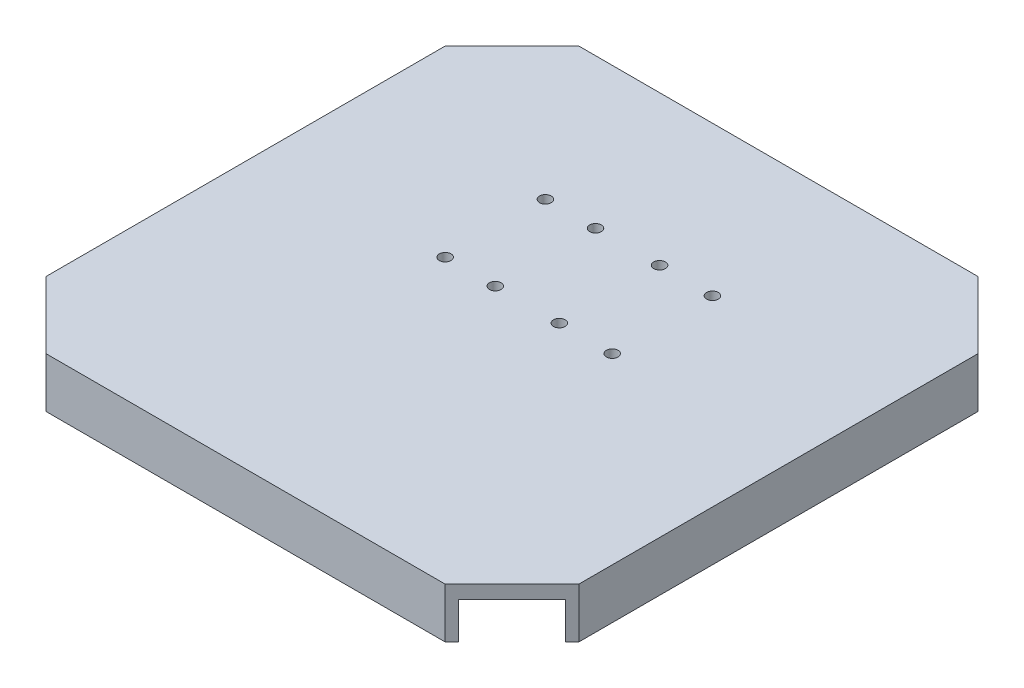
ISO-10303-21;
HEADER;
FILE_DESCRIPTION(('STEP AP214'),'2;1');
FILE_NAME('part.step','',(''),(''),'','','');
FILE_SCHEMA(('AUTOMOTIVE_DESIGN { 1 0 10303 214 1 1 1 1 }'));
ENDSEC;
DATA;
#1=APPLICATION_CONTEXT('core data for automotive mechanical design processes');
#2=APPLICATION_PROTOCOL_DEFINITION('international standard','automotive_design',2000,#1);
#3=PRODUCT_CONTEXT('',#1,'mechanical');
#4=PRODUCT('Part','Part','',(#3));
#5=PRODUCT_RELATED_PRODUCT_CATEGORY('part','',(#4));
#6=PRODUCT_DEFINITION_FORMATION('','',#4);
#7=PRODUCT_DEFINITION_CONTEXT('part definition',#1,'design');
#8=PRODUCT_DEFINITION('design','',#6,#7);
#9=PRODUCT_DEFINITION_SHAPE('','',#8);
#10=(LENGTH_UNIT() NAMED_UNIT(*) SI_UNIT(.MILLI.,.METRE.));
#11=(NAMED_UNIT(*) PLANE_ANGLE_UNIT() SI_UNIT($,.RADIAN.));
#12=(NAMED_UNIT(*) SI_UNIT($,.STERADIAN.) SOLID_ANGLE_UNIT());
#13=UNCERTAINTY_MEASURE_WITH_UNIT(LENGTH_MEASURE(1.E-05),#10,'distance_accuracy_value','');
#14=(GEOMETRIC_REPRESENTATION_CONTEXT(3) GLOBAL_UNCERTAINTY_ASSIGNED_CONTEXT((#13)) GLOBAL_UNIT_ASSIGNED_CONTEXT((#10,
#11,#12)) REPRESENTATION_CONTEXT('',''));
#15=CARTESIAN_POINT('',(0.,0.,0.));
#16=DIRECTION('',(0.,0.,1.));
#17=DIRECTION('',(1.,0.,0.));
#18=AXIS2_PLACEMENT_3D('',#15,#16,#17);
#19=CARTESIAN_POINT('',(0.,15.,0.));
#20=DIRECTION('',(0.,1.,0.));
#21=DIRECTION('',(0.,0.,1.));
#22=AXIS2_PLACEMENT_3D('',#19,#20,#21);
#23=PLANE('',#22);
#24=CARTESIAN_POINT('',(69.7500000000003,15.,-84.75));
#25=DIRECTION('',(0.,1.,0.));
#26=DIRECTION('',(0.,0.,1.));
#27=AXIS2_PLACEMENT_3D('',#24,#25,#26);
#28=CIRCLE('',#27,1.75);
#29=CARTESIAN_POINT('',(69.7500000000003,15.,-83.));
#30=VERTEX_POINT('',#29);
#31=EDGE_CURVE('E362',#30,#30,#28,.T.);
#32=ORIENTED_EDGE('',*,*,#31,.F.);
#33=EDGE_LOOP('',(#32));
#34=FACE_BOUND('',#33,.T.);
#35=CARTESIAN_POINT('',(104.75,15.,-84.75));
#36=DIRECTION('',(0.,-1.,0.));
#37=DIRECTION('',(0.,0.,-1.));
#38=AXIS2_PLACEMENT_3D('',#35,#36,#37);
#39=CIRCLE('',#38,1.75);
#40=CARTESIAN_POINT('',(104.75,15.,-86.5));
#41=VERTEX_POINT('',#40);
#42=EDGE_CURVE('E378',#41,#41,#39,.T.);
#43=ORIENTED_EDGE('',*,*,#42,.T.);
#44=EDGE_LOOP('',(#43));
#45=FACE_BOUND('',#44,.T.);
#46=CARTESIAN_POINT('',(54.7500000000003,15.,-84.75));
#47=DIRECTION('',(0.,1.,0.));
#48=DIRECTION('',(0.,0.,1.));
#49=AXIS2_PLACEMENT_3D('',#46,#47,#48);
#50=CIRCLE('',#49,1.75);
#51=CARTESIAN_POINT('',(54.7500000000003,15.,-83.));
#52=VERTEX_POINT('',#51);
#53=EDGE_CURVE('E386',#52,#52,#50,.T.);
#54=ORIENTED_EDGE('',*,*,#53,.F.);
#55=EDGE_LOOP('',(#54));
#56=FACE_BOUND('',#55,.T.);
#57=CARTESIAN_POINT('',(54.75,15.,-114.75));
#58=DIRECTION('',(0.,1.,0.));
#59=DIRECTION('',(0.,0.,1.));
#60=AXIS2_PLACEMENT_3D('',#57,#58,#59);
#61=CIRCLE('',#60,1.75);
#62=CARTESIAN_POINT('',(54.75,15.,-113.));
#63=VERTEX_POINT('',#62);
#64=EDGE_CURVE('E334',#63,#63,#61,.T.);
#65=ORIENTED_EDGE('',*,*,#64,.F.);
#66=EDGE_LOOP('',(#65));
#67=FACE_BOUND('',#66,.T.);
#68=DIRECTION('',(0.,0.,-1.));
#69=VECTOR('',#68,1.);
#70=CARTESIAN_POINT('',(0.,15.,0.));
#71=LINE('',#70,#69);
#72=CARTESIAN_POINT('',(0.,15.,-20.));
#73=VERTEX_POINT('',#72);
#74=CARTESIAN_POINT('',(0.,15.,-139.5));
#75=VERTEX_POINT('',#74);
#76=EDGE_CURVE('E195',#73,#75,#71,.T.);
#77=ORIENTED_EDGE('',*,*,#76,.F.);
#78=DIRECTION('',(0.707106781186546,0.,0.707106781186549));
#79=VECTOR('',#78,1.);
#80=CARTESIAN_POINT('',(9.99999999999999,15.,-9.99999999999996));
#81=LINE('',#80,#79);
#82=CARTESIAN_POINT('',(19.9999999999999,15.,0.));
#83=VERTEX_POINT('',#82);
#84=EDGE_CURVE('E246',#73,#83,#81,.T.);
#85=ORIENTED_EDGE('',*,*,#84,.T.);
#86=DIRECTION('',(1.,0.,0.));
#87=VECTOR('',#86,1.);
#88=CARTESIAN_POINT('',(0.,15.,0.));
#89=LINE('',#88,#87);
#90=CARTESIAN_POINT('',(139.5,15.,0.));
#91=VERTEX_POINT('',#90);
#92=EDGE_CURVE('E249',#83,#91,#89,.T.);
#93=ORIENTED_EDGE('',*,*,#92,.T.);
#94=DIRECTION('',(-0.707106781186546,0.,0.707106781186549));
#95=VECTOR('',#94,1.);
#96=CARTESIAN_POINT('',(69.7500000000003,15.,69.75));
#97=LINE('',#96,#95);
#98=CARTESIAN_POINT('',(159.5,15.,-20.0000000000001));
#99=VERTEX_POINT('',#98);
#100=EDGE_CURVE('E258',#99,#91,#97,.T.);
#101=ORIENTED_EDGE('',*,*,#100,.F.);
#102=DIRECTION('',(0.,0.,-1.));
#103=VECTOR('',#102,1.);
#104=CARTESIAN_POINT('',(159.5,15.,0.));
#105=LINE('',#104,#103);
#106=CARTESIAN_POINT('',(159.5,15.,-139.5));
#107=VERTEX_POINT('',#106);
#108=EDGE_CURVE('E134',#99,#107,#105,.T.);
#109=ORIENTED_EDGE('',*,*,#108,.T.);
#110=DIRECTION('',(-0.707106781186546,0.,-0.707106781186549));
#111=VECTOR('',#110,1.);
#112=CARTESIAN_POINT('',(149.5,15.,-149.5));
#113=LINE('',#112,#111);
#114=CARTESIAN_POINT('',(139.5,15.,-159.5));
#115=VERTEX_POINT('',#114);
#116=EDGE_CURVE('E125',#107,#115,#113,.T.);
#117=ORIENTED_EDGE('',*,*,#116,.T.);
#118=DIRECTION('',(1.,0.,0.));
#119=VECTOR('',#118,1.);
#120=CARTESIAN_POINT('',(0.,15.,-159.5));
#121=LINE('',#120,#119);
#122=CARTESIAN_POINT('',(19.9999999999999,15.,-159.5));
#123=VERTEX_POINT('',#122);
#124=EDGE_CURVE('E131',#123,#115,#121,.T.);
#125=ORIENTED_EDGE('',*,*,#124,.F.);
#126=DIRECTION('',(0.707106781186546,0.,-0.707106781186549));
#127=VECTOR('',#126,1.);
#128=CARTESIAN_POINT('',(-69.75,15.,-69.7499999999997));
#129=LINE('',#128,#127);
#130=EDGE_CURVE('E157',#75,#123,#129,.T.);
#131=ORIENTED_EDGE('',*,*,#130,.F.);
#132=EDGE_LOOP('',(#77,#85,#93,#101,#109,#117,#125,#131));
#133=FACE_BOUND('',#132,.T.);
#134=CARTESIAN_POINT('',(88.9266444896547,15.,-84.75));
#135=DIRECTION('',(0.,1.,0.));
#136=DIRECTION('',(0.,0.,1.));
#137=AXIS2_PLACEMENT_3D('',#134,#135,#136);
#138=CIRCLE('',#137,1.75);
#139=CARTESIAN_POINT('',(88.9266444896547,15.,-83.));
#140=VERTEX_POINT('',#139);
#141=EDGE_CURVE('E370',#140,#140,#138,.T.);
#142=ORIENTED_EDGE('',*,*,#141,.F.);
#143=EDGE_LOOP('',(#142));
#144=FACE_BOUND('',#143,.T.);
#145=CARTESIAN_POINT('',(69.75,15.,-114.75));
#146=DIRECTION('',(0.,1.,0.));
#147=DIRECTION('',(0.,0.,1.));
#148=AXIS2_PLACEMENT_3D('',#145,#146,#147);
#149=CIRCLE('',#148,1.75);
#150=CARTESIAN_POINT('',(69.75,15.,-113.));
#151=VERTEX_POINT('',#150);
#152=EDGE_CURVE('E338',#151,#151,#149,.T.);
#153=ORIENTED_EDGE('',*,*,#152,.F.);
#154=EDGE_LOOP('',(#153));
#155=FACE_BOUND('',#154,.T.);
#156=CARTESIAN_POINT('',(88.9266444896544,15.,-114.75));
#157=DIRECTION('',(0.,1.,0.));
#158=DIRECTION('',(0.,0.,1.));
#159=AXIS2_PLACEMENT_3D('',#156,#157,#158);
#160=CIRCLE('',#159,1.75);
#161=CARTESIAN_POINT('',(88.9266444896544,15.,-113.));
#162=VERTEX_POINT('',#161);
#163=EDGE_CURVE('E346',#162,#162,#160,.T.);
#164=ORIENTED_EDGE('',*,*,#163,.F.);
#165=EDGE_LOOP('',(#164));
#166=FACE_BOUND('',#165,.T.);
#167=CARTESIAN_POINT('',(104.75,15.,-114.75));
#168=DIRECTION('',(0.,-1.,0.));
#169=DIRECTION('',(0.,0.,-1.));
#170=AXIS2_PLACEMENT_3D('',#167,#168,#169);
#171=CIRCLE('',#170,1.75);
#172=CARTESIAN_POINT('',(104.75,15.,-116.5));
#173=VERTEX_POINT('',#172);
#174=EDGE_CURVE('E354',#173,#173,#171,.T.);
#175=ORIENTED_EDGE('',*,*,#174,.T.);
#176=EDGE_LOOP('',(#175));
#177=FACE_BOUND('',#176,.T.);
#178=ADVANCED_FACE('F45',(#34,#45,#56,#67,#133,#144,#155,#166,#177),#23,.T.);
#179=CARTESIAN_POINT('',(0.,0.,0.));
#180=DIRECTION('',(0.,1.,0.));
#181=DIRECTION('',(0.,0.,1.));
#182=AXIS2_PLACEMENT_3D('',#179,#180,#181);
#183=PLANE('',#182);
#184=DIRECTION('',(0.707106781186546,0.,-0.707106781186549));
#185=VECTOR('',#184,1.);
#186=CARTESIAN_POINT('',(-69.75,0.,-69.7499999999997));
#187=LINE('',#186,#185);
#188=CARTESIAN_POINT('',(0.,0.,-139.5));
#189=VERTEX_POINT('',#188);
#190=CARTESIAN_POINT('',(2.00000000000002,0.,-141.5));
#191=VERTEX_POINT('',#190);
#192=EDGE_CURVE('E191',#189,#191,#187,.T.);
#193=ORIENTED_EDGE('',*,*,#192,.T.);
#194=DIRECTION('',(0.,0.,1.));
#195=VECTOR('',#194,1.);
#196=CARTESIAN_POINT('',(2.,0.,0.));
#197=LINE('',#196,#195);
#198=CARTESIAN_POINT('',(2.,0.,-18.));
#199=VERTEX_POINT('',#198);
#200=EDGE_CURVE('E54',#191,#199,#197,.T.);
#201=ORIENTED_EDGE('',*,*,#200,.T.);
#202=DIRECTION('',(0.707106781186546,0.,0.707106781186549));
#203=VECTOR('',#202,1.);
#204=CARTESIAN_POINT('',(9.99999999999999,0.,-9.99999999999996));
#205=LINE('',#204,#203);
#206=CARTESIAN_POINT('',(0.,0.,-20.));
#207=VERTEX_POINT('',#206);
#208=EDGE_CURVE('E168',#207,#199,#205,.T.);
#209=ORIENTED_EDGE('',*,*,#208,.F.);
#210=DIRECTION('',(0.,0.,-1.));
#211=VECTOR('',#210,1.);
#212=CARTESIAN_POINT('',(0.,0.,0.));
#213=LINE('',#212,#211);
#214=EDGE_CURVE('E163',#207,#189,#213,.T.);
#215=ORIENTED_EDGE('',*,*,#214,.T.);
#216=EDGE_LOOP('',(#193,#201,#209,#215));
#217=FACE_BOUND('',#216,.T.);
#218=ADVANCED_FACE('F231',(#217),#183,.F.);
#219=CARTESIAN_POINT('',(17.9999999999999,0.,-2.));
#220=VERTEX_POINT('',#219);
#221=CARTESIAN_POINT('',(19.9999999999999,0.,0.));
#222=VERTEX_POINT('',#221);
#223=EDGE_CURVE('E166',#220,#222,#205,.T.);
#224=ORIENTED_EDGE('',*,*,#223,.F.);
#225=DIRECTION('',(1.,0.,0.));
#226=VECTOR('',#225,1.);
#227=CARTESIAN_POINT('',(0.,0.,-2.));
#228=LINE('',#227,#226);
#229=CARTESIAN_POINT('',(141.5,0.,-2.));
#230=VERTEX_POINT('',#229);
#231=EDGE_CURVE('E222',#220,#230,#228,.T.);
#232=ORIENTED_EDGE('',*,*,#231,.T.);
#233=DIRECTION('',(-0.707106781186546,0.,0.707106781186549));
#234=VECTOR('',#233,1.);
#235=CARTESIAN_POINT('',(69.7500000000003,0.,69.75));
#236=LINE('',#235,#234);
#237=CARTESIAN_POINT('',(139.5,0.,0.));
#238=VERTEX_POINT('',#237);
#239=EDGE_CURVE('E176',#230,#238,#236,.T.);
#240=ORIENTED_EDGE('',*,*,#239,.T.);
#241=DIRECTION('',(1.,0.,0.));
#242=VECTOR('',#241,1.);
#243=CARTESIAN_POINT('',(0.,0.,0.));
#244=LINE('',#243,#242);
#245=EDGE_CURVE('E172',#222,#238,#244,.T.);
#246=ORIENTED_EDGE('',*,*,#245,.F.);
#247=EDGE_LOOP('',(#224,#232,#240,#246));
#248=FACE_BOUND('',#247,.T.);
#249=ADVANCED_FACE('F273',(#248),#183,.F.);
#250=CARTESIAN_POINT('',(159.5,0.,-20.0000000000001));
#251=VERTEX_POINT('',#250);
#252=CARTESIAN_POINT('',(157.5,0.,-18.));
#253=VERTEX_POINT('',#252);
#254=EDGE_CURVE('E177',#251,#253,#236,.T.);
#255=ORIENTED_EDGE('',*,*,#254,.T.);
#256=DIRECTION('',(0.,0.,-1.));
#257=VECTOR('',#256,1.);
#258=CARTESIAN_POINT('',(157.5,0.,0.));
#259=LINE('',#258,#257);
#260=CARTESIAN_POINT('',(157.5,0.,-141.5));
#261=VERTEX_POINT('',#260);
#262=EDGE_CURVE('E218',#253,#261,#259,.T.);
#263=ORIENTED_EDGE('',*,*,#262,.T.);
#264=DIRECTION('',(-0.707106781186546,0.,-0.707106781186549));
#265=VECTOR('',#264,1.);
#266=CARTESIAN_POINT('',(149.5,0.,-149.5));
#267=LINE('',#266,#265);
#268=CARTESIAN_POINT('',(159.5,0.,-139.5));
#269=VERTEX_POINT('',#268);
#270=EDGE_CURVE('E184',#269,#261,#267,.T.);
#271=ORIENTED_EDGE('',*,*,#270,.F.);
#272=DIRECTION('',(0.,0.,-1.));
#273=VECTOR('',#272,1.);
#274=CARTESIAN_POINT('',(159.5,0.,0.));
#275=LINE('',#274,#273);
#276=EDGE_CURVE('E181',#251,#269,#275,.T.);
#277=ORIENTED_EDGE('',*,*,#276,.F.);
#278=EDGE_LOOP('',(#255,#263,#271,#277));
#279=FACE_BOUND('',#278,.T.);
#280=ADVANCED_FACE('F446',(#279),#183,.F.);
#281=CARTESIAN_POINT('',(0.,15.,0.));
#282=DIRECTION('',(-1.,0.,0.));
#283=DIRECTION('',(0.,0.,1.));
#284=AXIS2_PLACEMENT_3D('',#281,#282,#283);
#285=PLANE('',#284);
#286=ORIENTED_EDGE('',*,*,#214,.F.);
#287=DIRECTION('',(0.,-1.,0.));
#288=VECTOR('',#287,1.);
#289=CARTESIAN_POINT('',(0.,15.,-20.));
#290=LINE('',#289,#288);
#291=EDGE_CURVE('E106',#73,#207,#290,.T.);
#292=ORIENTED_EDGE('',*,*,#291,.F.);
#293=ORIENTED_EDGE('',*,*,#76,.T.);
#294=DIRECTION('',(0.,-1.,0.));
#295=VECTOR('',#294,1.);
#296=CARTESIAN_POINT('',(0.,15.,-139.5));
#297=LINE('',#296,#295);
#298=EDGE_CURVE('E70',#75,#189,#297,.T.);
#299=ORIENTED_EDGE('',*,*,#298,.T.);
#300=EDGE_LOOP('',(#286,#292,#293,#299));
#301=FACE_BOUND('',#300,.T.);
#302=ADVANCED_FACE('F47',(#301),#285,.T.);
#303=CARTESIAN_POINT('',(9.99999999999999,15.,-9.99999999999996));
#304=DIRECTION('',(0.707106781186549,0.,-0.707106781186546));
#305=DIRECTION('',(-0.707106781186546,0.,-0.707106781186549));
#306=AXIS2_PLACEMENT_3D('',#303,#304,#305);
#307=PLANE('',#306);
#308=ORIENTED_EDGE('',*,*,#208,.T.);
#309=DIRECTION('',(0.,1.,0.));
#310=VECTOR('',#309,1.);
#311=CARTESIAN_POINT('',(2.,15.,-18.));
#312=LINE('',#311,#310);
#313=CARTESIAN_POINT('',(2.,11.,-18.));
#314=VERTEX_POINT('',#313);
#315=EDGE_CURVE('E244',#199,#314,#312,.T.);
#316=ORIENTED_EDGE('',*,*,#315,.T.);
#317=DIRECTION('',(-0.707106781186546,0.,-0.707106781186549));
#318=VECTOR('',#317,1.);
#319=CARTESIAN_POINT('',(9.99999999999999,11.,-9.99999999999996));
#320=LINE('',#319,#318);
#321=CARTESIAN_POINT('',(17.9999999999999,11.,-2.));
#322=VERTEX_POINT('',#321);
#323=EDGE_CURVE('E167',#322,#314,#320,.T.);
#324=ORIENTED_EDGE('',*,*,#323,.F.);
#325=DIRECTION('',(0.,-1.,0.));
#326=VECTOR('',#325,1.);
#327=CARTESIAN_POINT('',(17.9999999999999,15.,-2.));
#328=LINE('',#327,#326);
#329=EDGE_CURVE('E293',#322,#220,#328,.T.);
#330=ORIENTED_EDGE('',*,*,#329,.T.);
#331=ORIENTED_EDGE('',*,*,#223,.T.);
#332=DIRECTION('',(0.,-1.,0.));
#333=VECTOR('',#332,1.);
#334=CARTESIAN_POINT('',(19.9999999999999,15.,0.));
#335=LINE('',#334,#333);
#336=EDGE_CURVE('E209',#83,#222,#335,.T.);
#337=ORIENTED_EDGE('',*,*,#336,.F.);
#338=ORIENTED_EDGE('',*,*,#84,.F.);
#339=ORIENTED_EDGE('',*,*,#291,.T.);
#340=EDGE_LOOP('',(#308,#316,#324,#330,#331,#337,#338,#339));
#341=FACE_BOUND('',#340,.T.);
#342=ADVANCED_FACE('F241',(#341),#307,.F.);
#343=CARTESIAN_POINT('',(0.,15.,0.));
#344=DIRECTION('',(0.,0.,-1.));
#345=DIRECTION('',(-1.,0.,0.));
#346=AXIS2_PLACEMENT_3D('',#343,#344,#345);
#347=PLANE('',#346);
#348=ORIENTED_EDGE('',*,*,#245,.T.);
#349=DIRECTION('',(0.,-1.,0.));
#350=VECTOR('',#349,1.);
#351=CARTESIAN_POINT('',(139.5,15.,0.));
#352=LINE('',#351,#350);
#353=EDGE_CURVE('E205',#91,#238,#352,.T.);
#354=ORIENTED_EDGE('',*,*,#353,.F.);
#355=ORIENTED_EDGE('',*,*,#92,.F.);
#356=ORIENTED_EDGE('',*,*,#336,.T.);
#357=EDGE_LOOP('',(#348,#354,#355,#356));
#358=FACE_BOUND('',#357,.T.);
#359=ADVANCED_FACE('F269',(#358),#347,.F.);
#360=CARTESIAN_POINT('',(69.7500000000003,15.,69.75));
#361=DIRECTION('',(0.707106781186549,0.,0.707106781186546));
#362=DIRECTION('',(0.707106781186546,0.,-0.707106781186549));
#363=AXIS2_PLACEMENT_3D('',#360,#361,#362);
#364=PLANE('',#363);
#365=DIRECTION('',(0.,-1.,0.));
#366=VECTOR('',#365,1.);
#367=CARTESIAN_POINT('',(141.5,15.,-2.));
#368=LINE('',#367,#366);
#369=CARTESIAN_POINT('',(141.5,11.,-2.));
#370=VERTEX_POINT('',#369);
#371=EDGE_CURVE('E297',#370,#230,#368,.T.);
#372=ORIENTED_EDGE('',*,*,#371,.F.);
#373=DIRECTION('',(0.707106781186546,0.,-0.707106781186549));
#374=VECTOR('',#373,1.);
#375=CARTESIAN_POINT('',(69.7500000000003,11.,69.75));
#376=LINE('',#375,#374);
#377=CARTESIAN_POINT('',(157.5,11.,-18.));
#378=VERTEX_POINT('',#377);
#379=EDGE_CURVE('E282',#370,#378,#376,.T.);
#380=ORIENTED_EDGE('',*,*,#379,.T.);
#381=DIRECTION('',(0.,1.,0.));
#382=VECTOR('',#381,1.);
#383=CARTESIAN_POINT('',(157.5,15.,-18.));
#384=LINE('',#383,#382);
#385=EDGE_CURVE('E301',#253,#378,#384,.T.);
#386=ORIENTED_EDGE('',*,*,#385,.F.);
#387=ORIENTED_EDGE('',*,*,#254,.F.);
#388=DIRECTION('',(0.,-1.,0.));
#389=VECTOR('',#388,1.);
#390=CARTESIAN_POINT('',(159.5,15.,-20.0000000000001));
#391=LINE('',#390,#389);
#392=EDGE_CURVE('E202',#99,#251,#391,.T.);
#393=ORIENTED_EDGE('',*,*,#392,.F.);
#394=ORIENTED_EDGE('',*,*,#100,.T.);
#395=ORIENTED_EDGE('',*,*,#353,.T.);
#396=ORIENTED_EDGE('',*,*,#239,.F.);
#397=EDGE_LOOP('',(#372,#380,#386,#387,#393,#394,#395,#396));
#398=FACE_BOUND('',#397,.T.);
#399=ADVANCED_FACE('F264',(#398),#364,.T.);
#400=CARTESIAN_POINT('',(159.5,15.,0.));
#401=DIRECTION('',(-1.,0.,0.));
#402=DIRECTION('',(0.,0.,1.));
#403=AXIS2_PLACEMENT_3D('',#400,#401,#402);
#404=PLANE('',#403);
#405=ORIENTED_EDGE('',*,*,#276,.T.);
#406=DIRECTION('',(0.,-1.,0.));
#407=VECTOR('',#406,1.);
#408=CARTESIAN_POINT('',(159.5,15.,-139.5));
#409=LINE('',#408,#407);
#410=EDGE_CURVE('E151',#107,#269,#409,.T.);
#411=ORIENTED_EDGE('',*,*,#410,.F.);
#412=ORIENTED_EDGE('',*,*,#108,.F.);
#413=ORIENTED_EDGE('',*,*,#392,.T.);
#414=EDGE_LOOP('',(#405,#411,#412,#413));
#415=FACE_BOUND('',#414,.T.);
#416=ADVANCED_FACE('F453',(#415),#404,.F.);
#417=CARTESIAN_POINT('',(149.5,15.,-149.5));
#418=DIRECTION('',(-0.707106781186549,0.,0.707106781186546));
#419=DIRECTION('',(0.707106781186546,0.,0.707106781186549));
#420=AXIS2_PLACEMENT_3D('',#417,#418,#419);
#421=PLANE('',#420);
#422=ORIENTED_EDGE('',*,*,#270,.T.);
#423=DIRECTION('',(0.,1.,0.));
#424=VECTOR('',#423,1.);
#425=CARTESIAN_POINT('',(157.5,15.,-141.5));
#426=LINE('',#425,#424);
#427=CARTESIAN_POINT('',(157.5,11.,-141.5));
#428=VERTEX_POINT('',#427);
#429=EDGE_CURVE('E305',#261,#428,#426,.T.);
#430=ORIENTED_EDGE('',*,*,#429,.T.);
#431=DIRECTION('',(0.707106781186546,0.,0.707106781186549));
#432=VECTOR('',#431,1.);
#433=CARTESIAN_POINT('',(149.5,11.,-149.5));
#434=LINE('',#433,#432);
#435=CARTESIAN_POINT('',(141.5,11.,-157.5));
#436=VERTEX_POINT('',#435);
#437=EDGE_CURVE('E285',#436,#428,#434,.T.);
#438=ORIENTED_EDGE('',*,*,#437,.F.);
#439=DIRECTION('',(0.,-1.,0.));
#440=VECTOR('',#439,1.);
#441=CARTESIAN_POINT('',(141.5,15.,-157.5));
#442=LINE('',#441,#440);
#443=CARTESIAN_POINT('',(141.5,0.,-157.5));
#444=VERTEX_POINT('',#443);
#445=EDGE_CURVE('E309',#436,#444,#442,.T.);
#446=ORIENTED_EDGE('',*,*,#445,.T.);
#447=CARTESIAN_POINT('',(139.5,0.,-159.5));
#448=VERTEX_POINT('',#447);
#449=EDGE_CURVE('E146',#444,#448,#267,.T.);
#450=ORIENTED_EDGE('',*,*,#449,.T.);
#451=DIRECTION('',(0.,-1.,0.));
#452=VECTOR('',#451,1.);
#453=CARTESIAN_POINT('',(139.5,15.,-159.5));
#454=LINE('',#453,#452);
#455=EDGE_CURVE('E141',#115,#448,#454,.T.);
#456=ORIENTED_EDGE('',*,*,#455,.F.);
#457=ORIENTED_EDGE('',*,*,#116,.F.);
#458=ORIENTED_EDGE('',*,*,#410,.T.);
#459=EDGE_LOOP('',(#422,#430,#438,#446,#450,#456,#457,#458));
#460=FACE_BOUND('',#459,.T.);
#461=ADVANCED_FACE('F143',(#460),#421,.F.);
#462=CARTESIAN_POINT('',(0.,15.,-159.5));
#463=DIRECTION('',(0.,0.,-1.));
#464=DIRECTION('',(-1.,0.,0.));
#465=AXIS2_PLACEMENT_3D('',#462,#463,#464);
#466=PLANE('',#465);
#467=DIRECTION('',(1.,0.,0.));
#468=VECTOR('',#467,1.);
#469=CARTESIAN_POINT('',(0.,0.,-159.5));
#470=LINE('',#469,#468);
#471=CARTESIAN_POINT('',(19.9999999999999,0.,-159.5));
#472=VERTEX_POINT('',#471);
#473=EDGE_CURVE('E187',#472,#448,#470,.T.);
#474=ORIENTED_EDGE('',*,*,#473,.F.);
#475=DIRECTION('',(0.,-1.,0.));
#476=VECTOR('',#475,1.);
#477=CARTESIAN_POINT('',(19.9999999999999,15.,-159.5));
#478=LINE('',#477,#476);
#479=EDGE_CURVE('E152',#123,#472,#478,.T.);
#480=ORIENTED_EDGE('',*,*,#479,.F.);
#481=ORIENTED_EDGE('',*,*,#124,.T.);
#482=ORIENTED_EDGE('',*,*,#455,.T.);
#483=EDGE_LOOP('',(#474,#480,#481,#482));
#484=FACE_BOUND('',#483,.T.);
#485=ADVANCED_FACE('F154',(#484),#466,.T.);
#486=CARTESIAN_POINT('',(-69.75,15.,-69.7499999999997));
#487=DIRECTION('',(-0.707106781186549,0.,-0.707106781186546));
#488=DIRECTION('',(-0.707106781186546,0.,0.707106781186549));
#489=AXIS2_PLACEMENT_3D('',#486,#487,#488);
#490=PLANE('',#489);
#491=DIRECTION('',(0.,1.,0.));
#492=VECTOR('',#491,1.);
#493=CARTESIAN_POINT('',(2.00000000000003,15.,-141.5));
#494=LINE('',#493,#492);
#495=CARTESIAN_POINT('',(2.00000000000002,11.,-141.5));
#496=VERTEX_POINT('',#495);
#497=EDGE_CURVE('E290',#191,#496,#494,.T.);
#498=ORIENTED_EDGE('',*,*,#497,.F.);
#499=ORIENTED_EDGE('',*,*,#192,.F.);
#500=ORIENTED_EDGE('',*,*,#298,.F.);
#501=ORIENTED_EDGE('',*,*,#130,.T.);
#502=ORIENTED_EDGE('',*,*,#479,.T.);
#503=CARTESIAN_POINT('',(17.9999999999999,0.,-157.5));
#504=VERTEX_POINT('',#503);
#505=EDGE_CURVE('E190',#504,#472,#187,.T.);
#506=ORIENTED_EDGE('',*,*,#505,.F.);
#507=DIRECTION('',(0.,-1.,0.));
#508=VECTOR('',#507,1.);
#509=CARTESIAN_POINT('',(17.9999999999999,15.,-157.5));
#510=LINE('',#509,#508);
#511=CARTESIAN_POINT('',(17.9999999999999,11.,-157.5));
#512=VERTEX_POINT('',#511);
#513=EDGE_CURVE('E61',#512,#504,#510,.T.);
#514=ORIENTED_EDGE('',*,*,#513,.F.);
#515=DIRECTION('',(-0.707106781186546,0.,0.707106781186549));
#516=VECTOR('',#515,1.);
#517=CARTESIAN_POINT('',(-69.75,11.,-69.7499999999997));
#518=LINE('',#517,#516);
#519=EDGE_CURVE('E11',#512,#496,#518,.T.);
#520=ORIENTED_EDGE('',*,*,#519,.T.);
#521=EDGE_LOOP('',(#498,#499,#500,#501,#502,#506,#514,#520));
#522=FACE_BOUND('',#521,.T.);
#523=ADVANCED_FACE('F444',(#522),#490,.T.);
#524=ORIENTED_EDGE('',*,*,#449,.F.);
#525=DIRECTION('',(-1.,0.,0.));
#526=VECTOR('',#525,1.);
#527=CARTESIAN_POINT('',(0.,0.,-157.5));
#528=LINE('',#527,#526);
#529=EDGE_CURVE('E215',#444,#504,#528,.T.);
#530=ORIENTED_EDGE('',*,*,#529,.T.);
#531=ORIENTED_EDGE('',*,*,#505,.T.);
#532=ORIENTED_EDGE('',*,*,#473,.T.);
#533=EDGE_LOOP('',(#524,#530,#531,#532));
#534=FACE_BOUND('',#533,.T.);
#535=ADVANCED_FACE('F431',(#534),#183,.F.);
#536=CARTESIAN_POINT('',(0.,11.,0.));
#537=DIRECTION('',(0.,-1.,0.));
#538=DIRECTION('',(0.,0.,-1.));
#539=AXIS2_PLACEMENT_3D('',#536,#537,#538);
#540=PLANE('',#539);
#541=ORIENTED_EDGE('',*,*,#323,.T.);
#542=DIRECTION('',(0.,0.,-1.));
#543=VECTOR('',#542,1.);
#544=CARTESIAN_POINT('',(2.,11.,-2.));
#545=LINE('',#544,#543);
#546=EDGE_CURVE('E326',#314,#496,#545,.T.);
#547=ORIENTED_EDGE('',*,*,#546,.T.);
#548=ORIENTED_EDGE('',*,*,#519,.F.);
#549=DIRECTION('',(1.,0.,0.));
#550=VECTOR('',#549,1.);
#551=CARTESIAN_POINT('',(2.00000000000002,11.,-157.5));
#552=LINE('',#551,#550);
#553=EDGE_CURVE('E322',#512,#436,#552,.T.);
#554=ORIENTED_EDGE('',*,*,#553,.T.);
#555=ORIENTED_EDGE('',*,*,#437,.T.);
#556=DIRECTION('',(0.,0.,1.));
#557=VECTOR('',#556,1.);
#558=CARTESIAN_POINT('',(157.5,11.,-2.));
#559=LINE('',#558,#557);
#560=EDGE_CURVE('E318',#428,#378,#559,.T.);
#561=ORIENTED_EDGE('',*,*,#560,.T.);
#562=ORIENTED_EDGE('',*,*,#379,.F.);
#563=DIRECTION('',(-1.,0.,0.));
#564=VECTOR('',#563,1.);
#565=CARTESIAN_POINT('',(2.,11.,-2.));
#566=LINE('',#565,#564);
#567=EDGE_CURVE('E314',#370,#322,#566,.T.);
#568=ORIENTED_EDGE('',*,*,#567,.T.);
#569=EDGE_LOOP('',(#541,#547,#548,#554,#555,#561,#562,#568));
#570=FACE_BOUND('',#569,.T.);
#571=ADVANCED_FACE('F427',(#570),#540,.T.);
#572=CARTESIAN_POINT('',(2.,11.,-2.));
#573=DIRECTION('',(-1.,0.,0.));
#574=DIRECTION('',(0.,0.,1.));
#575=AXIS2_PLACEMENT_3D('',#572,#573,#574);
#576=PLANE('',#575);
#577=ORIENTED_EDGE('',*,*,#200,.F.);
#578=ORIENTED_EDGE('',*,*,#497,.T.);
#579=ORIENTED_EDGE('',*,*,#546,.F.);
#580=ORIENTED_EDGE('',*,*,#315,.F.);
#581=EDGE_LOOP('',(#577,#578,#579,#580));
#582=FACE_BOUND('',#581,.T.);
#583=ADVANCED_FACE('F430',(#582),#576,.F.);
#584=CARTESIAN_POINT('',(2.,11.,-2.));
#585=DIRECTION('',(0.,0.,1.));
#586=DIRECTION('',(1.,0.,0.));
#587=AXIS2_PLACEMENT_3D('',#584,#585,#586);
#588=PLANE('',#587);
#589=ORIENTED_EDGE('',*,*,#567,.F.);
#590=ORIENTED_EDGE('',*,*,#371,.T.);
#591=ORIENTED_EDGE('',*,*,#231,.F.);
#592=ORIENTED_EDGE('',*,*,#329,.F.);
#593=EDGE_LOOP('',(#589,#590,#591,#592));
#594=FACE_BOUND('',#593,.T.);
#595=ADVANCED_FACE('F433',(#594),#588,.F.);
#596=CARTESIAN_POINT('',(157.5,11.,-2.));
#597=DIRECTION('',(1.,0.,0.));
#598=DIRECTION('',(0.,0.,-1.));
#599=AXIS2_PLACEMENT_3D('',#596,#597,#598);
#600=PLANE('',#599);
#601=ORIENTED_EDGE('',*,*,#385,.T.);
#602=ORIENTED_EDGE('',*,*,#560,.F.);
#603=ORIENTED_EDGE('',*,*,#429,.F.);
#604=ORIENTED_EDGE('',*,*,#262,.F.);
#605=EDGE_LOOP('',(#601,#602,#603,#604));
#606=FACE_BOUND('',#605,.T.);
#607=ADVANCED_FACE('F422',(#606),#600,.F.);
#608=CARTESIAN_POINT('',(2.00000000000002,11.,-157.5));
#609=DIRECTION('',(0.,0.,-1.));
#610=DIRECTION('',(-1.,0.,0.));
#611=AXIS2_PLACEMENT_3D('',#608,#609,#610);
#612=PLANE('',#611);
#613=ORIENTED_EDGE('',*,*,#553,.F.);
#614=ORIENTED_EDGE('',*,*,#513,.T.);
#615=ORIENTED_EDGE('',*,*,#529,.F.);
#616=ORIENTED_EDGE('',*,*,#445,.F.);
#617=EDGE_LOOP('',(#613,#614,#615,#616));
#618=FACE_BOUND('',#617,.T.);
#619=ADVANCED_FACE('F413',(#618),#612,.F.);
#620=CARTESIAN_POINT('',(54.75,12.5,-114.75));
#621=DIRECTION('',(0.,1.,0.));
#622=DIRECTION('',(0.,0.,1.));
#623=AXIS2_PLACEMENT_3D('',#620,#621,#622);
#624=CYLINDRICAL_SURFACE('',#623,1.75);
#625=CARTESIAN_POINT('',(54.75,12.5,-114.75));
#626=DIRECTION('',(0.,1.,0.));
#627=DIRECTION('',(0.,0.,1.));
#628=AXIS2_PLACEMENT_3D('',#625,#626,#627);
#629=CIRCLE('',#628,1.75);
#630=CARTESIAN_POINT('',(54.75,12.5,-113.));
#631=VERTEX_POINT('',#630);
#632=EDGE_CURVE('E330',#631,#631,#629,.T.);
#633=ORIENTED_EDGE('',*,*,#632,.F.);
#634=EDGE_LOOP('',(#633));
#635=FACE_BOUND('',#634,.T.);
#636=ORIENTED_EDGE('',*,*,#64,.T.);
#637=EDGE_LOOP('',(#636));
#638=FACE_BOUND('',#637,.T.);
#639=ADVANCED_FACE('F411',(#635,#638),#624,.F.);
#640=CARTESIAN_POINT('',(54.75,12.5,-114.75));
#641=DIRECTION('',(0.,1.,0.));
#642=DIRECTION('',(0.,0.,1.));
#643=AXIS2_PLACEMENT_3D('',#640,#641,#642);
#644=PLANE('',#643);
#645=ORIENTED_EDGE('',*,*,#632,.T.);
#646=EDGE_LOOP('',(#645));
#647=FACE_BOUND('',#646,.T.);
#648=ADVANCED_FACE('F401',(#647),#644,.T.);
#649=CARTESIAN_POINT('',(54.7500000000003,12.5,-84.75));
#650=DIRECTION('',(0.,1.,0.));
#651=DIRECTION('',(0.,0.,1.));
#652=AXIS2_PLACEMENT_3D('',#649,#650,#651);
#653=CYLINDRICAL_SURFACE('',#652,1.75);
#654=CARTESIAN_POINT('',(54.7500000000003,12.5,-84.75));
#655=DIRECTION('',(0.,1.,0.));
#656=DIRECTION('',(0.,0.,1.));
#657=AXIS2_PLACEMENT_3D('',#654,#655,#656);
#658=CIRCLE('',#657,1.75);
#659=CARTESIAN_POINT('',(54.7500000000003,12.5,-83.));
#660=VERTEX_POINT('',#659);
#661=EDGE_CURVE('E390',#660,#660,#658,.T.);
#662=ORIENTED_EDGE('',*,*,#661,.F.);
#663=EDGE_LOOP('',(#662));
#664=FACE_BOUND('',#663,.T.);
#665=ORIENTED_EDGE('',*,*,#53,.T.);
#666=EDGE_LOOP('',(#665));
#667=FACE_BOUND('',#666,.T.);
#668=ADVANCED_FACE('F398',(#664,#667),#653,.F.);
#669=CARTESIAN_POINT('',(54.7500000000003,12.5,-84.75));
#670=DIRECTION('',(0.,1.,0.));
#671=DIRECTION('',(0.,0.,1.));
#672=AXIS2_PLACEMENT_3D('',#669,#670,#671);
#673=PLANE('',#672);
#674=ORIENTED_EDGE('',*,*,#661,.T.);
#675=EDGE_LOOP('',(#674));
#676=FACE_BOUND('',#675,.T.);
#677=ADVANCED_FACE('F396',(#676),#673,.T.);
#678=CARTESIAN_POINT('',(104.75,12.5,-84.75));
#679=DIRECTION('',(0.,1.,0.));
#680=DIRECTION('',(0.,0.,1.));
#681=AXIS2_PLACEMENT_3D('',#678,#679,#680);
#682=CYLINDRICAL_SURFACE('',#681,1.75);
#683=CARTESIAN_POINT('',(104.75,12.5,-84.75));
#684=DIRECTION('',(0.,-1.,0.));
#685=DIRECTION('',(0.,0.,-1.));
#686=AXIS2_PLACEMENT_3D('',#683,#684,#685);
#687=CIRCLE('',#686,1.75);
#688=CARTESIAN_POINT('',(104.75,12.5,-86.5));
#689=VERTEX_POINT('',#688);
#690=EDGE_CURVE('E382',#689,#689,#687,.T.);
#691=ORIENTED_EDGE('',*,*,#690,.T.);
#692=EDGE_LOOP('',(#691));
#693=FACE_BOUND('',#692,.T.);
#694=ORIENTED_EDGE('',*,*,#42,.F.);
#695=EDGE_LOOP('',(#694));
#696=FACE_BOUND('',#695,.T.);
#697=ADVANCED_FACE('F550',(#693,#696),#682,.F.);
#698=CARTESIAN_POINT('',(104.75,12.5,-84.75));
#699=DIRECTION('',(0.,-1.,0.));
#700=DIRECTION('',(0.,0.,-1.));
#701=AXIS2_PLACEMENT_3D('',#698,#699,#700);
#702=PLANE('',#701);
#703=ORIENTED_EDGE('',*,*,#690,.F.);
#704=EDGE_LOOP('',(#703));
#705=FACE_BOUND('',#704,.T.);
#706=ADVANCED_FACE('F560',(#705),#702,.F.);
#707=CARTESIAN_POINT('',(88.9266444896547,12.5,-84.75));
#708=DIRECTION('',(0.,1.,0.));
#709=DIRECTION('',(0.,0.,1.));
#710=AXIS2_PLACEMENT_3D('',#707,#708,#709);
#711=CYLINDRICAL_SURFACE('',#710,1.75);
#712=CARTESIAN_POINT('',(88.9266444896547,12.5,-84.75));
#713=DIRECTION('',(0.,1.,0.));
#714=DIRECTION('',(0.,0.,1.));
#715=AXIS2_PLACEMENT_3D('',#712,#713,#714);
#716=CIRCLE('',#715,1.75);
#717=CARTESIAN_POINT('',(88.9266444896547,12.5,-83.));
#718=VERTEX_POINT('',#717);
#719=EDGE_CURVE('E374',#718,#718,#716,.T.);
#720=ORIENTED_EDGE('',*,*,#719,.F.);
#721=EDGE_LOOP('',(#720));
#722=FACE_BOUND('',#721,.T.);
#723=ORIENTED_EDGE('',*,*,#141,.T.);
#724=EDGE_LOOP('',(#723));
#725=FACE_BOUND('',#724,.T.);
#726=ADVANCED_FACE('F571',(#722,#725),#711,.F.);
#727=CARTESIAN_POINT('',(88.9266444896547,12.5,-84.75));
#728=DIRECTION('',(0.,1.,0.));
#729=DIRECTION('',(0.,0.,1.));
#730=AXIS2_PLACEMENT_3D('',#727,#728,#729);
#731=PLANE('',#730);
#732=ORIENTED_EDGE('',*,*,#719,.T.);
#733=EDGE_LOOP('',(#732));
#734=FACE_BOUND('',#733,.T.);
#735=ADVANCED_FACE('F582',(#734),#731,.T.);
#736=CARTESIAN_POINT('',(69.75,12.5,-114.75));
#737=DIRECTION('',(0.,1.,0.));
#738=DIRECTION('',(0.,0.,1.));
#739=AXIS2_PLACEMENT_3D('',#736,#737,#738);
#740=CYLINDRICAL_SURFACE('',#739,1.75);
#741=CARTESIAN_POINT('',(69.75,12.5,-114.75));
#742=DIRECTION('',(0.,1.,0.));
#743=DIRECTION('',(0.,0.,1.));
#744=AXIS2_PLACEMENT_3D('',#741,#742,#743);
#745=CIRCLE('',#744,1.75);
#746=CARTESIAN_POINT('',(69.75,12.5,-113.));
#747=VERTEX_POINT('',#746);
#748=EDGE_CURVE('E342',#747,#747,#745,.T.);
#749=ORIENTED_EDGE('',*,*,#748,.F.);
#750=EDGE_LOOP('',(#749));
#751=FACE_BOUND('',#750,.T.);
#752=ORIENTED_EDGE('',*,*,#152,.T.);
#753=EDGE_LOOP('',(#752));
#754=FACE_BOUND('',#753,.T.);
#755=ADVANCED_FACE('F593',(#751,#754),#740,.F.);
#756=CARTESIAN_POINT('',(69.75,12.5,-114.75));
#757=DIRECTION('',(0.,1.,0.));
#758=DIRECTION('',(0.,0.,1.));
#759=AXIS2_PLACEMENT_3D('',#756,#757,#758);
#760=PLANE('',#759);
#761=ORIENTED_EDGE('',*,*,#748,.T.);
#762=EDGE_LOOP('',(#761));
#763=FACE_BOUND('',#762,.T.);
#764=ADVANCED_FACE('F604',(#763),#760,.T.);
#765=CARTESIAN_POINT('',(88.9266444896544,12.5,-114.75));
#766=DIRECTION('',(0.,1.,0.));
#767=DIRECTION('',(0.,0.,1.));
#768=AXIS2_PLACEMENT_3D('',#765,#766,#767);
#769=CYLINDRICAL_SURFACE('',#768,1.75);
#770=CARTESIAN_POINT('',(88.9266444896544,12.5,-114.75));
#771=DIRECTION('',(0.,1.,0.));
#772=DIRECTION('',(0.,0.,1.));
#773=AXIS2_PLACEMENT_3D('',#770,#771,#772);
#774=CIRCLE('',#773,1.75);
#775=CARTESIAN_POINT('',(88.9266444896544,12.5,-113.));
#776=VERTEX_POINT('',#775);
#777=EDGE_CURVE('E350',#776,#776,#774,.T.);
#778=ORIENTED_EDGE('',*,*,#777,.F.);
#779=EDGE_LOOP('',(#778));
#780=FACE_BOUND('',#779,.T.);
#781=ORIENTED_EDGE('',*,*,#163,.T.);
#782=EDGE_LOOP('',(#781));
#783=FACE_BOUND('',#782,.T.);
#784=ADVANCED_FACE('F615',(#780,#783),#769,.F.);
#785=CARTESIAN_POINT('',(88.9266444896544,12.5,-114.75));
#786=DIRECTION('',(0.,1.,0.));
#787=DIRECTION('',(0.,0.,1.));
#788=AXIS2_PLACEMENT_3D('',#785,#786,#787);
#789=PLANE('',#788);
#790=ORIENTED_EDGE('',*,*,#777,.T.);
#791=EDGE_LOOP('',(#790));
#792=FACE_BOUND('',#791,.T.);
#793=ADVANCED_FACE('F626',(#792),#789,.T.);
#794=CARTESIAN_POINT('',(104.75,12.5,-114.75));
#795=DIRECTION('',(0.,1.,0.));
#796=DIRECTION('',(0.,0.,1.));
#797=AXIS2_PLACEMENT_3D('',#794,#795,#796);
#798=CYLINDRICAL_SURFACE('',#797,1.75);
#799=CARTESIAN_POINT('',(104.75,12.5,-114.75));
#800=DIRECTION('',(0.,-1.,0.));
#801=DIRECTION('',(0.,0.,-1.));
#802=AXIS2_PLACEMENT_3D('',#799,#800,#801);
#803=CIRCLE('',#802,1.75);
#804=CARTESIAN_POINT('',(104.75,12.5,-116.5));
#805=VERTEX_POINT('',#804);
#806=EDGE_CURVE('E358',#805,#805,#803,.T.);
#807=ORIENTED_EDGE('',*,*,#806,.T.);
#808=EDGE_LOOP('',(#807));
#809=FACE_BOUND('',#808,.T.);
#810=ORIENTED_EDGE('',*,*,#174,.F.);
#811=EDGE_LOOP('',(#810));
#812=FACE_BOUND('',#811,.T.);
#813=ADVANCED_FACE('F637',(#809,#812),#798,.F.);
#814=CARTESIAN_POINT('',(104.75,12.5,-114.75));
#815=DIRECTION('',(0.,-1.,0.));
#816=DIRECTION('',(0.,0.,-1.));
#817=AXIS2_PLACEMENT_3D('',#814,#815,#816);
#818=PLANE('',#817);
#819=ORIENTED_EDGE('',*,*,#806,.F.);
#820=EDGE_LOOP('',(#819));
#821=FACE_BOUND('',#820,.T.);
#822=ADVANCED_FACE('F647',(#821),#818,.F.);
#823=CARTESIAN_POINT('',(69.7500000000003,12.5,-84.75));
#824=DIRECTION('',(0.,1.,0.));
#825=DIRECTION('',(0.,0.,1.));
#826=AXIS2_PLACEMENT_3D('',#823,#824,#825);
#827=CYLINDRICAL_SURFACE('',#826,1.75);
#828=CARTESIAN_POINT('',(69.7500000000003,12.5,-84.75));
#829=DIRECTION('',(0.,1.,0.));
#830=DIRECTION('',(0.,0.,1.));
#831=AXIS2_PLACEMENT_3D('',#828,#829,#830);
#832=CIRCLE('',#831,1.75);
#833=CARTESIAN_POINT('',(69.7500000000003,12.5,-83.));
#834=VERTEX_POINT('',#833);
#835=EDGE_CURVE('E366',#834,#834,#832,.T.);
#836=ORIENTED_EDGE('',*,*,#835,.F.);
#837=EDGE_LOOP('',(#836));
#838=FACE_BOUND('',#837,.T.);
#839=ORIENTED_EDGE('',*,*,#31,.T.);
#840=EDGE_LOOP('',(#839));
#841=FACE_BOUND('',#840,.T.);
#842=ADVANCED_FACE('F658',(#838,#841),#827,.F.);
#843=CARTESIAN_POINT('',(69.7500000000003,12.5,-84.75));
#844=DIRECTION('',(0.,1.,0.));
#845=DIRECTION('',(0.,0.,1.));
#846=AXIS2_PLACEMENT_3D('',#843,#844,#845);
#847=PLANE('',#846);
#848=ORIENTED_EDGE('',*,*,#835,.T.);
#849=EDGE_LOOP('',(#848));
#850=FACE_BOUND('',#849,.T.);
#851=ADVANCED_FACE('F669',(#850),#847,.T.);
#852=CLOSED_SHELL('',(#178,#218,#249,#280,#302,#342,#359,#399,#416,#461,#485,#523,#535,#571,
#583,#595,#607,#619,#639,#648,#668,#677,#697,#706,#726,#735,#755,#764,#784,#793,#813,#822,#842,#851));
#853=MANIFOLD_SOLID_BREP('B2',#852);
#854=ADVANCED_BREP_SHAPE_REPRESENTATION('',(#18,#853),#14);
#855=SHAPE_DEFINITION_REPRESENTATION(#9,#854);
ENDSEC;
END-ISO-10303-21;
